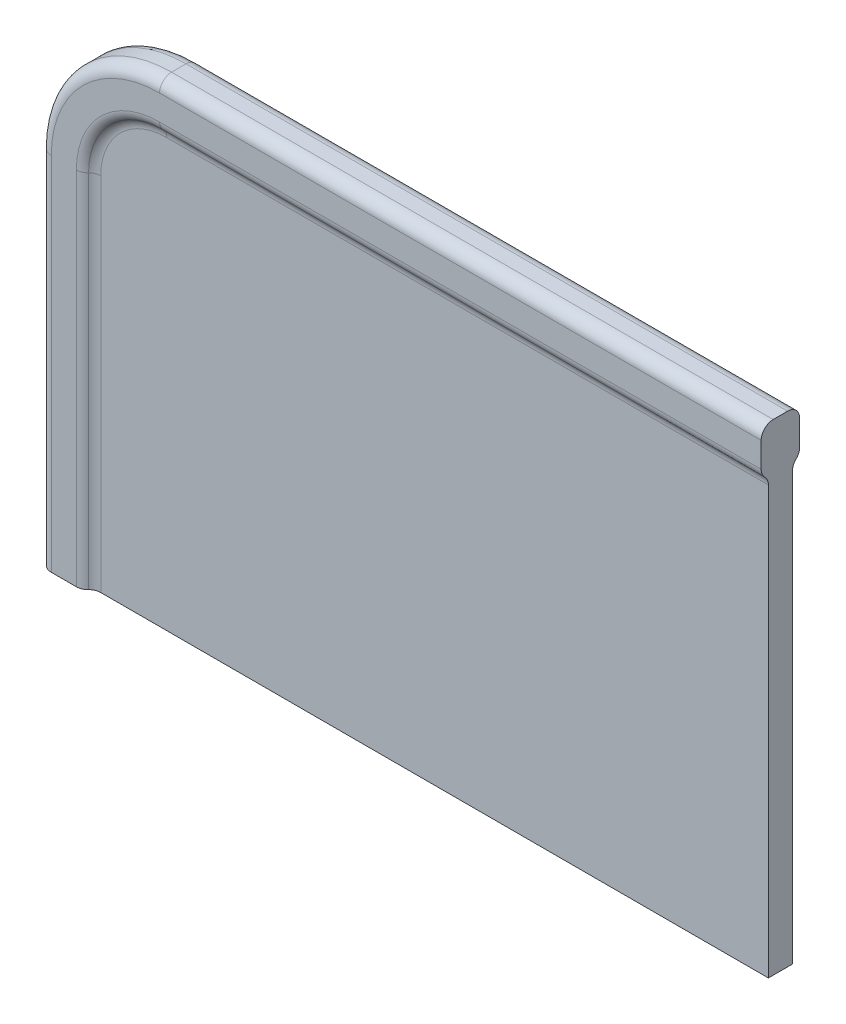
ISO-10303-21;
HEADER;
FILE_DESCRIPTION(('STEP AP214'),'2;1');
FILE_NAME('part.step','',(''),(''),'','','');
FILE_SCHEMA(('AUTOMOTIVE_DESIGN { 1 0 10303 214 1 1 1 1 }'));
ENDSEC;
DATA;
#1=APPLICATION_CONTEXT('core data for automotive mechanical design processes');
#2=APPLICATION_PROTOCOL_DEFINITION('international standard','automotive_design',2000,#1);
#3=PRODUCT_CONTEXT('',#1,'mechanical');
#4=PRODUCT('Part','Part','',(#3));
#5=PRODUCT_RELATED_PRODUCT_CATEGORY('part','',(#4));
#6=PRODUCT_DEFINITION_FORMATION('','',#4);
#7=PRODUCT_DEFINITION_CONTEXT('part definition',#1,'design');
#8=PRODUCT_DEFINITION('design','',#6,#7);
#9=PRODUCT_DEFINITION_SHAPE('','',#8);
#10=(LENGTH_UNIT() NAMED_UNIT(*) SI_UNIT(.MILLI.,.METRE.));
#11=(NAMED_UNIT(*) PLANE_ANGLE_UNIT() SI_UNIT($,.RADIAN.));
#12=(NAMED_UNIT(*) SI_UNIT($,.STERADIAN.) SOLID_ANGLE_UNIT());
#13=UNCERTAINTY_MEASURE_WITH_UNIT(LENGTH_MEASURE(1.E-05),#10,'distance_accuracy_value','');
#14=(GEOMETRIC_REPRESENTATION_CONTEXT(3) GLOBAL_UNCERTAINTY_ASSIGNED_CONTEXT((#13)) GLOBAL_UNIT_ASSIGNED_CONTEXT((#10,
#11,#12)) REPRESENTATION_CONTEXT('',''));
#15=CARTESIAN_POINT('',(0.,0.,0.));
#16=DIRECTION('',(0.,0.,1.));
#17=DIRECTION('',(1.,0.,0.));
#18=AXIS2_PLACEMENT_3D('',#15,#16,#17);
#19=CARTESIAN_POINT('',(0.,0.,0.));
#20=DIRECTION('',(0.,1.,0.));
#21=DIRECTION('',(0.,0.,1.));
#22=AXIS2_PLACEMENT_3D('',#19,#20,#21);
#23=PLANE('',#22);
#24=CARTESIAN_POINT('',(-176.175128514172,0.,6.35));
#25=DIRECTION('',(0.,1.,0.));
#26=DIRECTION('',(0.,0.,1.));
#27=AXIS2_PLACEMENT_3D('',#24,#25,#26);
#28=CIRCLE('',#27,3.175);
#29=CARTESIAN_POINT('',(-178.442532040235,0.,4.12749999999999));
#30=VERTEX_POINT('',#29);
#31=CARTESIAN_POINT('',(-176.175128514172,0.,3.175));
#32=VERTEX_POINT('',#31);
#33=EDGE_CURVE('E342',#30,#32,#28,.F.);
#34=ORIENTED_EDGE('',*,*,#33,.F.);
#35=CARTESIAN_POINT('',(-180.709935566297,0.,1.905));
#36=DIRECTION('',(0.,1.,0.));
#37=DIRECTION('',(0.,0.,1.));
#38=AXIS2_PLACEMENT_3D('',#35,#36,#37);
#39=CIRCLE('',#38,3.175);
#40=CARTESIAN_POINT('',(-180.709935566297,0.,5.08));
#41=VERTEX_POINT('',#40);
#42=EDGE_CURVE('E211',#30,#41,#39,.F.);
#43=ORIENTED_EDGE('',*,*,#42,.T.);
#44=DIRECTION('',(-1.,0.,0.));
#45=VECTOR('',#44,1.);
#46=CARTESIAN_POINT('',(171.45,0.,5.08));
#47=LINE('',#46,#45);
#48=CARTESIAN_POINT('',(-187.325,0.,5.08));
#49=VERTEX_POINT('',#48);
#50=EDGE_CURVE('E235',#41,#49,#47,.T.);
#51=ORIENTED_EDGE('',*,*,#50,.T.);
#52=CARTESIAN_POINT('',(-187.325,0.,1.905));
#53=DIRECTION('',(0.,1.,0.));
#54=DIRECTION('',(0.,0.,1.));
#55=AXIS2_PLACEMENT_3D('',#52,#53,#54);
#56=CIRCLE('',#55,3.175);
#57=CARTESIAN_POINT('',(-190.5,0.,1.905));
#58=VERTEX_POINT('',#57);
#59=EDGE_CURVE('E224',#49,#58,#56,.F.);
#60=ORIENTED_EDGE('',*,*,#59,.T.);
#61=DIRECTION('',(0.,0.,1.));
#62=VECTOR('',#61,1.);
#63=CARTESIAN_POINT('',(-190.5,0.,3.175));
#64=LINE('',#63,#62);
#65=CARTESIAN_POINT('',(-190.5,0.,-1.905));
#66=VERTEX_POINT('',#65);
#67=EDGE_CURVE('E240',#66,#58,#64,.T.);
#68=ORIENTED_EDGE('',*,*,#67,.F.);
#69=CARTESIAN_POINT('',(-187.325,0.,-1.905));
#70=DIRECTION('',(0.,1.,0.));
#71=DIRECTION('',(0.,0.,1.));
#72=AXIS2_PLACEMENT_3D('',#69,#70,#71);
#73=CIRCLE('',#72,3.175);
#74=CARTESIAN_POINT('',(-187.325,0.,-5.08));
#75=VERTEX_POINT('',#74);
#76=EDGE_CURVE('E221',#66,#75,#73,.F.);
#77=ORIENTED_EDGE('',*,*,#76,.T.);
#78=DIRECTION('',(1.,0.,0.));
#79=VECTOR('',#78,1.);
#80=CARTESIAN_POINT('',(171.45,0.,-5.08));
#81=LINE('',#80,#79);
#82=CARTESIAN_POINT('',(-180.709935566297,0.,-5.08));
#83=VERTEX_POINT('',#82);
#84=EDGE_CURVE('E230',#75,#83,#81,.T.);
#85=ORIENTED_EDGE('',*,*,#84,.T.);
#86=CARTESIAN_POINT('',(-180.709935566297,0.,-1.905));
#87=DIRECTION('',(0.,1.,0.));
#88=DIRECTION('',(0.,0.,1.));
#89=AXIS2_PLACEMENT_3D('',#86,#87,#88);
#90=CIRCLE('',#89,3.175);
#91=CARTESIAN_POINT('',(-178.442532040235,0.,-4.12749999999999));
#92=VERTEX_POINT('',#91);
#93=EDGE_CURVE('E216',#83,#92,#90,.F.);
#94=ORIENTED_EDGE('',*,*,#93,.T.);
#95=CARTESIAN_POINT('',(-176.175128514172,0.,-6.35));
#96=DIRECTION('',(0.,1.,0.));
#97=DIRECTION('',(0.,0.,1.));
#98=AXIS2_PLACEMENT_3D('',#95,#96,#97);
#99=CIRCLE('',#98,3.175);
#100=CARTESIAN_POINT('',(-176.175128514172,0.,-3.175));
#101=VERTEX_POINT('',#100);
#102=EDGE_CURVE('E193',#101,#92,#99,.F.);
#103=ORIENTED_EDGE('',*,*,#102,.F.);
#104=DIRECTION('',(1.,0.,0.));
#105=VECTOR('',#104,1.);
#106=CARTESIAN_POINT('',(0.,0.,-3.175));
#107=LINE('',#106,#105);
#108=CARTESIAN_POINT('',(0.,0.,-3.175));
#109=VERTEX_POINT('',#108);
#110=EDGE_CURVE('E227',#101,#109,#107,.T.);
#111=ORIENTED_EDGE('',*,*,#110,.T.);
#112=DIRECTION('',(0.,0.,-1.));
#113=VECTOR('',#112,1.);
#114=CARTESIAN_POINT('',(0.,0.,0.));
#115=LINE('',#114,#113);
#116=CARTESIAN_POINT('',(0.,0.,3.175));
#117=VERTEX_POINT('',#116);
#118=EDGE_CURVE('E11',#117,#109,#115,.T.);
#119=ORIENTED_EDGE('',*,*,#118,.F.);
#120=DIRECTION('',(1.,0.,0.));
#121=VECTOR('',#120,1.);
#122=CARTESIAN_POINT('',(0.,0.,3.175));
#123=LINE('',#122,#121);
#124=EDGE_CURVE('E348',#32,#117,#123,.T.);
#125=ORIENTED_EDGE('',*,*,#124,.F.);
#126=EDGE_LOOP('',(#34,#43,#51,#60,#68,#77,#85,#94,#103,#111,#119,#125));
#127=FACE_BOUND('',#126,.T.);
#128=ADVANCED_FACE('F39',(#127),#23,.F.);
#129=CARTESIAN_POINT('',(0.,0.,0.));
#130=DIRECTION('',(1.,0.,0.));
#131=DIRECTION('',(0.,0.,-1.));
#132=AXIS2_PLACEMENT_3D('',#129,#130,#131);
#133=PLANE('',#132);
#134=CARTESIAN_POINT('',(0.,112.675128514172,6.35));
#135=DIRECTION('',(1.,0.,0.));
#136=DIRECTION('',(0.,0.,-1.));
#137=AXIS2_PLACEMENT_3D('',#134,#135,#136);
#138=CIRCLE('',#137,3.175);
#139=CARTESIAN_POINT('',(0.,114.942532040235,4.1275));
#140=VERTEX_POINT('',#139);
#141=CARTESIAN_POINT('',(0.,112.675128514172,3.175));
#142=VERTEX_POINT('',#141);
#143=EDGE_CURVE('E210',#140,#142,#138,.F.);
#144=ORIENTED_EDGE('',*,*,#143,.T.);
#145=DIRECTION('',(0.,-1.,0.));
#146=VECTOR('',#145,1.);
#147=CARTESIAN_POINT('',(0.,0.,3.175));
#148=LINE('',#147,#146);
#149=EDGE_CURVE('E233',#142,#117,#148,.T.);
#150=ORIENTED_EDGE('',*,*,#149,.T.);
#151=ORIENTED_EDGE('',*,*,#118,.T.);
#152=DIRECTION('',(0.,-1.,0.));
#153=VECTOR('',#152,1.);
#154=CARTESIAN_POINT('',(0.,0.,-3.175));
#155=LINE('',#154,#153);
#156=CARTESIAN_POINT('',(0.,112.675128514172,-3.175));
#157=VERTEX_POINT('',#156);
#158=EDGE_CURVE('E209',#157,#109,#155,.T.);
#159=ORIENTED_EDGE('',*,*,#158,.F.);
#160=CARTESIAN_POINT('',(0.,112.675128514172,-6.35));
#161=DIRECTION('',(1.,0.,0.));
#162=DIRECTION('',(0.,0.,-1.));
#163=AXIS2_PLACEMENT_3D('',#160,#161,#162);
#164=CIRCLE('',#163,3.175);
#165=CARTESIAN_POINT('',(0.,114.942532040235,-4.1275));
#166=VERTEX_POINT('',#165);
#167=EDGE_CURVE('E43',#157,#166,#164,.F.);
#168=ORIENTED_EDGE('',*,*,#167,.T.);
#169=CARTESIAN_POINT('',(0.,117.209935566297,-1.905));
#170=DIRECTION('',(1.,0.,0.));
#171=DIRECTION('',(0.,0.,-1.));
#172=AXIS2_PLACEMENT_3D('',#169,#170,#171);
#173=CIRCLE('',#172,3.175);
#174=CARTESIAN_POINT('',(0.,117.209935566297,-5.08));
#175=VERTEX_POINT('',#174);
#176=EDGE_CURVE('E196',#175,#166,#173,.F.);
#177=ORIENTED_EDGE('',*,*,#176,.F.);
#178=DIRECTION('',(0.,-1.,0.));
#179=VECTOR('',#178,1.);
#180=CARTESIAN_POINT('',(0.,107.95,-5.08));
#181=LINE('',#180,#179);
#182=CARTESIAN_POINT('',(0.,123.825,-5.08));
#183=VERTEX_POINT('',#182);
#184=EDGE_CURVE('E346',#183,#175,#181,.T.);
#185=ORIENTED_EDGE('',*,*,#184,.F.);
#186=CARTESIAN_POINT('',(0.,123.825,-1.905));
#187=DIRECTION('',(1.,0.,0.));
#188=DIRECTION('',(0.,0.,-1.));
#189=AXIS2_PLACEMENT_3D('',#186,#187,#188);
#190=CIRCLE('',#189,3.175);
#191=CARTESIAN_POINT('',(0.,127.,-1.905));
#192=VERTEX_POINT('',#191);
#193=EDGE_CURVE('E203',#192,#183,#190,.F.);
#194=ORIENTED_EDGE('',*,*,#193,.F.);
#195=DIRECTION('',(0.,0.,1.));
#196=VECTOR('',#195,1.);
#197=CARTESIAN_POINT('',(0.,127.,3.175));
#198=LINE('',#197,#196);
#199=CARTESIAN_POINT('',(0.,127.,1.905));
#200=VERTEX_POINT('',#199);
#201=EDGE_CURVE('E238',#192,#200,#198,.T.);
#202=ORIENTED_EDGE('',*,*,#201,.T.);
#203=CARTESIAN_POINT('',(0.,123.825,1.905));
#204=DIRECTION('',(1.,0.,0.));
#205=DIRECTION('',(0.,0.,-1.));
#206=AXIS2_PLACEMENT_3D('',#203,#204,#205);
#207=CIRCLE('',#206,3.175);
#208=CARTESIAN_POINT('',(0.,123.825,5.08));
#209=VERTEX_POINT('',#208);
#210=EDGE_CURVE('E345',#209,#200,#207,.F.);
#211=ORIENTED_EDGE('',*,*,#210,.F.);
#212=DIRECTION('',(0.,1.,0.));
#213=VECTOR('',#212,1.);
#214=CARTESIAN_POINT('',(0.,107.95,5.08));
#215=LINE('',#214,#213);
#216=CARTESIAN_POINT('',(0.,117.209935566297,5.08));
#217=VERTEX_POINT('',#216);
#218=EDGE_CURVE('E351',#217,#209,#215,.T.);
#219=ORIENTED_EDGE('',*,*,#218,.F.);
#220=CARTESIAN_POINT('',(0.,117.209935566297,1.905));
#221=DIRECTION('',(1.,0.,0.));
#222=DIRECTION('',(0.,0.,-1.));
#223=AXIS2_PLACEMENT_3D('',#220,#221,#222);
#224=CIRCLE('',#223,3.175);
#225=EDGE_CURVE('E202',#140,#217,#224,.F.);
#226=ORIENTED_EDGE('',*,*,#225,.F.);
#227=EDGE_LOOP('',(#144,#150,#151,#159,#168,#177,#185,#194,#202,#211,#219,#226));
#228=FACE_BOUND('',#227,.T.);
#229=ADVANCED_FACE('F207',(#228),#133,.T.);
#230=CARTESIAN_POINT('',(-158.75,95.25,3.175));
#231=DIRECTION('',(0.,0.,-1.));
#232=DIRECTION('',(-1.,0.,0.));
#233=AXIS2_PLACEMENT_3D('',#230,#231,#232);
#234=CYLINDRICAL_SURFACE('',#233,31.75);
#235=DIRECTION('',(0.,0.,-1.));
#236=VECTOR('',#235,1.);
#237=CARTESIAN_POINT('',(-190.5,95.25,3.175));
#238=LINE('',#237,#236);
#239=CARTESIAN_POINT('',(-190.5,95.25,1.905));
#240=VERTEX_POINT('',#239);
#241=CARTESIAN_POINT('',(-190.5,95.25,-1.905));
#242=VERTEX_POINT('',#241);
#243=EDGE_CURVE('E270',#240,#242,#238,.T.);
#244=ORIENTED_EDGE('',*,*,#243,.F.);
#245=CARTESIAN_POINT('',(-158.75,95.25,1.905));
#246=DIRECTION('',(0.,0.,1.));
#247=DIRECTION('',(1.,0.,0.));
#248=AXIS2_PLACEMENT_3D('',#245,#246,#247);
#249=CIRCLE('',#248,31.75);
#250=CARTESIAN_POINT('',(-158.75,127.,1.905));
#251=VERTEX_POINT('',#250);
#252=EDGE_CURVE('E260',#240,#251,#249,.F.);
#253=ORIENTED_EDGE('',*,*,#252,.T.);
#254=DIRECTION('',(0.,0.,-1.));
#255=VECTOR('',#254,1.);
#256=CARTESIAN_POINT('',(-158.75,127.,3.175));
#257=LINE('',#256,#255);
#258=CARTESIAN_POINT('',(-158.75,127.,-1.905));
#259=VERTEX_POINT('',#258);
#260=EDGE_CURVE('E274',#259,#251,#257,.F.);
#261=ORIENTED_EDGE('',*,*,#260,.F.);
#262=CARTESIAN_POINT('',(-158.75,95.25,-1.905));
#263=DIRECTION('',(0.,0.,-1.));
#264=DIRECTION('',(-1.,0.,0.));
#265=AXIS2_PLACEMENT_3D('',#262,#263,#264);
#266=CIRCLE('',#265,31.75);
#267=EDGE_CURVE('E265',#259,#242,#266,.F.);
#268=ORIENTED_EDGE('',*,*,#267,.T.);
#269=EDGE_LOOP('',(#244,#253,#261,#268));
#270=FACE_BOUND('',#269,.T.);
#271=ADVANCED_FACE('F405',(#270),#234,.T.);
#272=CARTESIAN_POINT('',(-158.75,95.25,1.905));
#273=DIRECTION('',(0.,0.,1.));
#274=DIRECTION('',(1.,0.,0.));
#275=AXIS2_PLACEMENT_3D('',#272,#273,#274);
#276=TOROIDAL_SURFACE('',#275,28.575,3.175);
#277=CARTESIAN_POINT('',(-187.325,95.25,1.905));
#278=DIRECTION('',(0.,1.,0.));
#279=DIRECTION('',(0.,0.,1.));
#280=AXIS2_PLACEMENT_3D('',#277,#278,#279);
#281=CIRCLE('',#280,3.175);
#282=CARTESIAN_POINT('',(-187.325,95.25,5.08));
#283=VERTEX_POINT('',#282);
#284=EDGE_CURVE('E273',#240,#283,#281,.T.);
#285=ORIENTED_EDGE('',*,*,#284,.T.);
#286=CARTESIAN_POINT('',(-158.75,95.25,5.08));
#287=DIRECTION('',(0.,0.,1.));
#288=DIRECTION('',(1.,0.,0.));
#289=AXIS2_PLACEMENT_3D('',#286,#287,#288);
#290=CIRCLE('',#289,28.575);
#291=CARTESIAN_POINT('',(-158.75,123.825,5.08));
#292=VERTEX_POINT('',#291);
#293=EDGE_CURVE('E268',#292,#283,#290,.T.);
#294=ORIENTED_EDGE('',*,*,#293,.F.);
#295=CARTESIAN_POINT('',(-158.75,123.825,1.905));
#296=DIRECTION('',(1.,0.,0.));
#297=DIRECTION('',(0.,0.,-1.));
#298=AXIS2_PLACEMENT_3D('',#295,#296,#297);
#299=CIRCLE('',#298,3.175);
#300=EDGE_CURVE('E299',#251,#292,#299,.T.);
#301=ORIENTED_EDGE('',*,*,#300,.F.);
#302=ORIENTED_EDGE('',*,*,#252,.F.);
#303=EDGE_LOOP('',(#285,#294,#301,#302));
#304=FACE_BOUND('',#303,.T.);
#305=ADVANCED_FACE('F420',(#304),#276,.T.);
#306=CARTESIAN_POINT('',(-158.75,95.25,-1.905));
#307=DIRECTION('',(0.,0.,-1.));
#308=DIRECTION('',(-1.,0.,0.));
#309=AXIS2_PLACEMENT_3D('',#306,#307,#308);
#310=TOROIDAL_SURFACE('',#309,28.575,3.175);
#311=CARTESIAN_POINT('',(-187.325,95.25,-1.905));
#312=DIRECTION('',(0.,1.,0.));
#313=DIRECTION('',(0.,0.,1.));
#314=AXIS2_PLACEMENT_3D('',#311,#312,#313);
#315=CIRCLE('',#314,3.175);
#316=CARTESIAN_POINT('',(-187.325,95.25,-5.08));
#317=VERTEX_POINT('',#316);
#318=EDGE_CURVE('E302',#317,#242,#315,.T.);
#319=ORIENTED_EDGE('',*,*,#318,.T.);
#320=ORIENTED_EDGE('',*,*,#267,.F.);
#321=CARTESIAN_POINT('',(-158.75,123.825,-1.905));
#322=DIRECTION('',(1.,0.,0.));
#323=DIRECTION('',(0.,0.,-1.));
#324=AXIS2_PLACEMENT_3D('',#321,#322,#323);
#325=CIRCLE('',#324,3.175);
#326=CARTESIAN_POINT('',(-158.75,123.825,-5.08));
#327=VERTEX_POINT('',#326);
#328=EDGE_CURVE('E305',#327,#259,#325,.T.);
#329=ORIENTED_EDGE('',*,*,#328,.F.);
#330=CARTESIAN_POINT('',(-158.75,95.25,-5.08));
#331=DIRECTION('',(0.,0.,-1.));
#332=DIRECTION('',(-1.,0.,0.));
#333=AXIS2_PLACEMENT_3D('',#330,#331,#332);
#334=CIRCLE('',#333,28.575);
#335=EDGE_CURVE('E258',#317,#327,#334,.T.);
#336=ORIENTED_EDGE('',*,*,#335,.F.);
#337=EDGE_LOOP('',(#319,#320,#329,#336));
#338=FACE_BOUND('',#337,.T.);
#339=ADVANCED_FACE('F401',(#338),#310,.T.);
#340=CARTESIAN_POINT('',(-158.75,95.25,-1.905));
#341=DIRECTION('',(0.,0.,-1.));
#342=DIRECTION('',(-1.,0.,0.));
#343=AXIS2_PLACEMENT_3D('',#340,#341,#342);
#344=TOROIDAL_SURFACE('',#343,21.959935566297,3.175);
#345=CARTESIAN_POINT('',(-158.75,117.209935566297,-1.905));
#346=DIRECTION('',(1.,0.,0.));
#347=DIRECTION('',(0.,0.,-1.));
#348=AXIS2_PLACEMENT_3D('',#345,#346,#347);
#349=CIRCLE('',#348,3.175);
#350=CARTESIAN_POINT('',(-158.75,114.942532040235,-4.1275));
#351=VERTEX_POINT('',#350);
#352=CARTESIAN_POINT('',(-158.75,117.209935566297,-5.08));
#353=VERTEX_POINT('',#352);
#354=EDGE_CURVE('E311',#351,#353,#349,.T.);
#355=ORIENTED_EDGE('',*,*,#354,.F.);
#356=CARTESIAN_POINT('',(-158.75,95.25,-4.12750000000006));
#357=DIRECTION('',(0.,0.,1.));
#358=DIRECTION('',(1.,0.,0.));
#359=AXIS2_PLACEMENT_3D('',#356,#357,#358);
#360=CIRCLE('',#359,19.6925320402346);
#361=CARTESIAN_POINT('',(-178.442532040235,95.25,-4.1275));
#362=VERTEX_POINT('',#361);
#363=EDGE_CURVE('E192',#351,#362,#360,.T.);
#364=ORIENTED_EDGE('',*,*,#363,.T.);
#365=CARTESIAN_POINT('',(-180.709935566297,95.25,-1.905));
#366=DIRECTION('',(0.,1.,0.));
#367=DIRECTION('',(0.,0.,1.));
#368=AXIS2_PLACEMENT_3D('',#365,#366,#367);
#369=CIRCLE('',#368,3.175);
#370=CARTESIAN_POINT('',(-180.709935566297,95.25,-5.08));
#371=VERTEX_POINT('',#370);
#372=EDGE_CURVE('E308',#362,#371,#369,.T.);
#373=ORIENTED_EDGE('',*,*,#372,.T.);
#374=CARTESIAN_POINT('',(-158.75,95.25,-5.08));
#375=DIRECTION('',(0.,0.,-1.));
#376=DIRECTION('',(-1.,0.,0.));
#377=AXIS2_PLACEMENT_3D('',#374,#375,#376);
#378=CIRCLE('',#377,21.959935566297);
#379=EDGE_CURVE('E261',#353,#371,#378,.F.);
#380=ORIENTED_EDGE('',*,*,#379,.F.);
#381=EDGE_LOOP('',(#355,#364,#373,#380));
#382=FACE_BOUND('',#381,.T.);
#383=ADVANCED_FACE('F376',(#382),#344,.T.);
#384=CARTESIAN_POINT('',(171.45,107.95,-5.08));
#385=DIRECTION('',(0.,0.,-1.));
#386=DIRECTION('',(1.,0.,0.));
#387=AXIS2_PLACEMENT_3D('',#384,#385,#386);
#388=PLANE('',#387);
#389=DIRECTION('',(-1.,0.,0.));
#390=VECTOR('',#389,1.);
#391=CARTESIAN_POINT('',(171.45,123.825,-5.08));
#392=LINE('',#391,#390);
#393=EDGE_CURVE('E293',#327,#183,#392,.F.);
#394=ORIENTED_EDGE('',*,*,#393,.T.);
#395=ORIENTED_EDGE('',*,*,#184,.T.);
#396=DIRECTION('',(1.,0.,0.));
#397=VECTOR('',#396,1.);
#398=CARTESIAN_POINT('',(-158.75,117.209935566297,-5.08));
#399=LINE('',#398,#397);
#400=EDGE_CURVE('E198',#175,#353,#399,.F.);
#401=ORIENTED_EDGE('',*,*,#400,.T.);
#402=ORIENTED_EDGE('',*,*,#379,.T.);
#403=DIRECTION('',(0.,1.,0.));
#404=VECTOR('',#403,1.);
#405=CARTESIAN_POINT('',(-180.709935566297,-107.95,-5.08));
#406=LINE('',#405,#404);
#407=EDGE_CURVE('E290',#371,#83,#406,.F.);
#408=ORIENTED_EDGE('',*,*,#407,.T.);
#409=ORIENTED_EDGE('',*,*,#84,.F.);
#410=DIRECTION('',(0.,-1.,0.));
#411=VECTOR('',#410,1.);
#412=CARTESIAN_POINT('',(-187.325,95.25,-5.08));
#413=LINE('',#412,#411);
#414=EDGE_CURVE('E256',#75,#317,#413,.F.);
#415=ORIENTED_EDGE('',*,*,#414,.T.);
#416=ORIENTED_EDGE('',*,*,#335,.T.);
#417=EDGE_LOOP('',(#394,#395,#401,#402,#408,#409,#415,#416));
#418=FACE_BOUND('',#417,.T.);
#419=ADVANCED_FACE('F387',(#418),#388,.T.);
#420=CARTESIAN_POINT('',(-180.709935566297,95.25,-1.905));
#421=DIRECTION('',(0.,-1.,0.));
#422=DIRECTION('',(0.,0.,-1.));
#423=AXIS2_PLACEMENT_3D('',#420,#421,#422);
#424=CYLINDRICAL_SURFACE('',#423,3.175);
#425=ORIENTED_EDGE('',*,*,#93,.F.);
#426=ORIENTED_EDGE('',*,*,#407,.F.);
#427=ORIENTED_EDGE('',*,*,#372,.F.);
#428=DIRECTION('',(0.,-1.,0.));
#429=VECTOR('',#428,1.);
#430=CARTESIAN_POINT('',(-178.442532040235,95.25,-4.12749999999999));
#431=LINE('',#430,#429);
#432=EDGE_CURVE('E245',#362,#92,#431,.T.);
#433=ORIENTED_EDGE('',*,*,#432,.T.);
#434=EDGE_LOOP('',(#425,#426,#427,#433));
#435=FACE_BOUND('',#434,.T.);
#436=ADVANCED_FACE('F381',(#435),#424,.T.);
#437=CARTESIAN_POINT('',(171.45,117.209935566297,-1.905));
#438=DIRECTION('',(-1.,0.,0.));
#439=DIRECTION('',(0.,0.,1.));
#440=AXIS2_PLACEMENT_3D('',#437,#438,#439);
#441=CYLINDRICAL_SURFACE('',#440,3.175);
#442=ORIENTED_EDGE('',*,*,#400,.F.);
#443=ORIENTED_EDGE('',*,*,#176,.T.);
#444=DIRECTION('',(-1.,0.,0.));
#445=VECTOR('',#444,1.);
#446=CARTESIAN_POINT('',(171.45,114.942532040235,-4.1275));
#447=LINE('',#446,#445);
#448=EDGE_CURVE('E183',#166,#351,#447,.T.);
#449=ORIENTED_EDGE('',*,*,#448,.T.);
#450=ORIENTED_EDGE('',*,*,#354,.T.);
#451=EDGE_LOOP('',(#442,#443,#449,#450));
#452=FACE_BOUND('',#451,.T.);
#453=ADVANCED_FACE('F197',(#452),#441,.T.);
#454=CARTESIAN_POINT('',(-158.75,95.25,-6.35));
#455=DIRECTION('',(0.,0.,1.));
#456=DIRECTION('',(1.,0.,0.));
#457=AXIS2_PLACEMENT_3D('',#454,#455,#456);
#458=TOROIDAL_SURFACE('',#457,17.4251285141723,3.175);
#459=CARTESIAN_POINT('',(-176.175128514172,95.25,-6.35));
#460=DIRECTION('',(0.,-1.,0.));
#461=DIRECTION('',(0.,0.,-1.));
#462=AXIS2_PLACEMENT_3D('',#459,#460,#461);
#463=CIRCLE('',#462,3.175);
#464=CARTESIAN_POINT('',(-176.175128514172,95.25,-3.175));
#465=VERTEX_POINT('',#464);
#466=EDGE_CURVE('E336',#465,#362,#463,.T.);
#467=ORIENTED_EDGE('',*,*,#466,.T.);
#468=ORIENTED_EDGE('',*,*,#363,.F.);
#469=CARTESIAN_POINT('',(-158.75,112.675128514172,-6.35));
#470=DIRECTION('',(-1.,0.,0.));
#471=DIRECTION('',(0.,0.,1.));
#472=AXIS2_PLACEMENT_3D('',#469,#470,#471);
#473=CIRCLE('',#472,3.175);
#474=CARTESIAN_POINT('',(-158.75,112.675128514172,-3.175));
#475=VERTEX_POINT('',#474);
#476=EDGE_CURVE('E48',#475,#351,#473,.T.);
#477=ORIENTED_EDGE('',*,*,#476,.F.);
#478=CARTESIAN_POINT('',(-158.75,95.25,-3.175));
#479=DIRECTION('',(0.,0.,-1.));
#480=DIRECTION('',(-1.,0.,0.));
#481=AXIS2_PLACEMENT_3D('',#478,#479,#480);
#482=CIRCLE('',#481,17.4251285141723);
#483=EDGE_CURVE('E244',#465,#475,#482,.T.);
#484=ORIENTED_EDGE('',*,*,#483,.F.);
#485=EDGE_LOOP('',(#467,#468,#477,#484));
#486=FACE_BOUND('',#485,.T.);
#487=ADVANCED_FACE('F373',(#486),#458,.F.);
#488=CARTESIAN_POINT('',(0.,0.,-3.175));
#489=DIRECTION('',(0.,0.,-1.));
#490=DIRECTION('',(-1.,0.,0.));
#491=AXIS2_PLACEMENT_3D('',#488,#489,#490);
#492=PLANE('',#491);
#493=DIRECTION('',(1.,0.,0.));
#494=VECTOR('',#493,1.);
#495=CARTESIAN_POINT('',(171.45,112.675128514172,-3.175));
#496=LINE('',#495,#494);
#497=EDGE_CURVE('E327',#475,#157,#496,.T.);
#498=ORIENTED_EDGE('',*,*,#497,.T.);
#499=ORIENTED_EDGE('',*,*,#158,.T.);
#500=ORIENTED_EDGE('',*,*,#110,.F.);
#501=DIRECTION('',(0.,1.,0.));
#502=VECTOR('',#501,1.);
#503=CARTESIAN_POINT('',(-176.175128514172,95.25,-3.175));
#504=LINE('',#503,#502);
#505=EDGE_CURVE('E242',#101,#465,#504,.T.);
#506=ORIENTED_EDGE('',*,*,#505,.T.);
#507=ORIENTED_EDGE('',*,*,#483,.T.);
#508=EDGE_LOOP('',(#498,#499,#500,#506,#507));
#509=FACE_BOUND('',#508,.T.);
#510=ADVANCED_FACE('F368',(#509),#492,.T.);
#511=CARTESIAN_POINT('',(171.45,112.675128514172,-6.35));
#512=DIRECTION('',(-1.,0.,0.));
#513=DIRECTION('',(0.,0.,1.));
#514=AXIS2_PLACEMENT_3D('',#511,#512,#513);
#515=CYLINDRICAL_SURFACE('',#514,3.175);
#516=ORIENTED_EDGE('',*,*,#167,.F.);
#517=ORIENTED_EDGE('',*,*,#497,.F.);
#518=ORIENTED_EDGE('',*,*,#476,.T.);
#519=ORIENTED_EDGE('',*,*,#448,.F.);
#520=EDGE_LOOP('',(#516,#517,#518,#519));
#521=FACE_BOUND('',#520,.T.);
#522=ADVANCED_FACE('F185',(#521),#515,.F.);
#523=CARTESIAN_POINT('',(-176.175128514172,95.25,-6.35));
#524=DIRECTION('',(0.,-1.,0.));
#525=DIRECTION('',(0.,0.,-1.));
#526=AXIS2_PLACEMENT_3D('',#523,#524,#525);
#527=CYLINDRICAL_SURFACE('',#526,3.175);
#528=ORIENTED_EDGE('',*,*,#505,.F.);
#529=ORIENTED_EDGE('',*,*,#102,.T.);
#530=ORIENTED_EDGE('',*,*,#432,.F.);
#531=ORIENTED_EDGE('',*,*,#466,.F.);
#532=EDGE_LOOP('',(#528,#529,#530,#531));
#533=FACE_BOUND('',#532,.T.);
#534=ADVANCED_FACE('F383',(#533),#527,.F.);
#535=CARTESIAN_POINT('',(-190.5,127.,3.175));
#536=DIRECTION('',(0.,-1.,0.));
#537=DIRECTION('',(0.,0.,-1.));
#538=AXIS2_PLACEMENT_3D('',#535,#536,#537);
#539=PLANE('',#538);
#540=ORIENTED_EDGE('',*,*,#201,.F.);
#541=DIRECTION('',(-1.,0.,0.));
#542=VECTOR('',#541,1.);
#543=CARTESIAN_POINT('',(-158.75,127.,-1.905));
#544=LINE('',#543,#542);
#545=EDGE_CURVE('E254',#192,#259,#544,.T.);
#546=ORIENTED_EDGE('',*,*,#545,.T.);
#547=ORIENTED_EDGE('',*,*,#260,.T.);
#548=DIRECTION('',(-1.,0.,0.));
#549=VECTOR('',#548,1.);
#550=CARTESIAN_POINT('',(171.45,127.,1.905));
#551=LINE('',#550,#549);
#552=EDGE_CURVE('E252',#251,#200,#551,.F.);
#553=ORIENTED_EDGE('',*,*,#552,.T.);
#554=EDGE_LOOP('',(#540,#546,#547,#553));
#555=FACE_BOUND('',#554,.T.);
#556=ADVANCED_FACE('F393',(#555),#539,.F.);
#557=CARTESIAN_POINT('',(-190.5,123.825,-1.905));
#558=DIRECTION('',(1.,0.,0.));
#559=DIRECTION('',(0.,0.,-1.));
#560=AXIS2_PLACEMENT_3D('',#557,#558,#559);
#561=CYLINDRICAL_SURFACE('',#560,3.175);
#562=ORIENTED_EDGE('',*,*,#545,.F.);
#563=ORIENTED_EDGE('',*,*,#193,.T.);
#564=ORIENTED_EDGE('',*,*,#393,.F.);
#565=ORIENTED_EDGE('',*,*,#328,.T.);
#566=EDGE_LOOP('',(#562,#563,#564,#565));
#567=FACE_BOUND('',#566,.T.);
#568=ADVANCED_FACE('F396',(#567),#561,.T.);
#569=CARTESIAN_POINT('',(-190.5,-127.,3.175));
#570=DIRECTION('',(1.,0.,0.));
#571=DIRECTION('',(0.,0.,-1.));
#572=AXIS2_PLACEMENT_3D('',#569,#570,#571);
#573=PLANE('',#572);
#574=DIRECTION('',(0.,-1.,0.));
#575=VECTOR('',#574,1.);
#576=CARTESIAN_POINT('',(-190.5,-107.95,-1.905));
#577=LINE('',#576,#575);
#578=EDGE_CURVE('E264',#242,#66,#577,.T.);
#579=ORIENTED_EDGE('',*,*,#578,.T.);
#580=ORIENTED_EDGE('',*,*,#67,.T.);
#581=DIRECTION('',(0.,-1.,0.));
#582=VECTOR('',#581,1.);
#583=CARTESIAN_POINT('',(-190.5,95.25,1.905));
#584=LINE('',#583,#582);
#585=EDGE_CURVE('E262',#58,#240,#584,.F.);
#586=ORIENTED_EDGE('',*,*,#585,.T.);
#587=ORIENTED_EDGE('',*,*,#243,.T.);
#588=EDGE_LOOP('',(#579,#580,#586,#587));
#589=FACE_BOUND('',#588,.T.);
#590=ADVANCED_FACE('F409',(#589),#573,.F.);
#591=CARTESIAN_POINT('',(-187.325,-127.,-1.905));
#592=DIRECTION('',(0.,1.,0.));
#593=DIRECTION('',(0.,0.,1.));
#594=AXIS2_PLACEMENT_3D('',#591,#592,#593);
#595=CYLINDRICAL_SURFACE('',#594,3.175);
#596=ORIENTED_EDGE('',*,*,#76,.F.);
#597=ORIENTED_EDGE('',*,*,#578,.F.);
#598=ORIENTED_EDGE('',*,*,#318,.F.);
#599=ORIENTED_EDGE('',*,*,#414,.F.);
#600=EDGE_LOOP('',(#596,#597,#598,#599));
#601=FACE_BOUND('',#600,.T.);
#602=ADVANCED_FACE('F412',(#601),#595,.T.);
#603=CARTESIAN_POINT('',(-158.75,95.25,1.905));
#604=DIRECTION('',(0.,0.,1.));
#605=DIRECTION('',(1.,0.,0.));
#606=AXIS2_PLACEMENT_3D('',#603,#604,#605);
#607=TOROIDAL_SURFACE('',#606,21.959935566297,3.175);
#608=CARTESIAN_POINT('',(-180.709935566297,95.25,1.905));
#609=DIRECTION('',(0.,1.,0.));
#610=DIRECTION('',(0.,0.,1.));
#611=AXIS2_PLACEMENT_3D('',#608,#609,#610);
#612=CIRCLE('',#611,3.175);
#613=CARTESIAN_POINT('',(-180.709935566297,95.25,5.08));
#614=VERTEX_POINT('',#613);
#615=CARTESIAN_POINT('',(-178.442532040235,95.25,4.1275));
#616=VERTEX_POINT('',#615);
#617=EDGE_CURVE('E313',#614,#616,#612,.T.);
#618=ORIENTED_EDGE('',*,*,#617,.T.);
#619=CARTESIAN_POINT('',(-158.75,95.25,4.12749999999997));
#620=DIRECTION('',(0.,0.,-1.));
#621=DIRECTION('',(-1.,0.,0.));
#622=AXIS2_PLACEMENT_3D('',#619,#620,#621);
#623=CIRCLE('',#622,19.6925320402346);
#624=CARTESIAN_POINT('',(-158.75,114.942532040235,4.1275));
#625=VERTEX_POINT('',#624);
#626=EDGE_CURVE('E249',#616,#625,#623,.T.);
#627=ORIENTED_EDGE('',*,*,#626,.T.);
#628=CARTESIAN_POINT('',(-158.75,117.209935566297,1.905));
#629=DIRECTION('',(1.,0.,0.));
#630=DIRECTION('',(0.,0.,-1.));
#631=AXIS2_PLACEMENT_3D('',#628,#629,#630);
#632=CIRCLE('',#631,3.175);
#633=CARTESIAN_POINT('',(-158.75,117.209935566297,5.08));
#634=VERTEX_POINT('',#633);
#635=EDGE_CURVE('E315',#634,#625,#632,.T.);
#636=ORIENTED_EDGE('',*,*,#635,.F.);
#637=CARTESIAN_POINT('',(-158.75,95.25,5.08));
#638=DIRECTION('',(0.,0.,1.));
#639=DIRECTION('',(1.,0.,0.));
#640=AXIS2_PLACEMENT_3D('',#637,#638,#639);
#641=CIRCLE('',#640,21.959935566297);
#642=EDGE_CURVE('E56',#614,#634,#641,.F.);
#643=ORIENTED_EDGE('',*,*,#642,.F.);
#644=EDGE_LOOP('',(#618,#627,#636,#643));
#645=FACE_BOUND('',#644,.T.);
#646=ADVANCED_FACE('F443',(#645),#607,.T.);
#647=CARTESIAN_POINT('',(171.45,107.95,5.08));
#648=DIRECTION('',(0.,0.,1.));
#649=DIRECTION('',(1.,0.,0.));
#650=AXIS2_PLACEMENT_3D('',#647,#648,#649);
#651=PLANE('',#650);
#652=DIRECTION('',(-1.,0.,0.));
#653=VECTOR('',#652,1.);
#654=CARTESIAN_POINT('',(171.45,117.209935566297,5.08));
#655=LINE('',#654,#653);
#656=EDGE_CURVE('E277',#634,#217,#655,.F.);
#657=ORIENTED_EDGE('',*,*,#656,.T.);
#658=ORIENTED_EDGE('',*,*,#218,.T.);
#659=DIRECTION('',(-1.,0.,0.));
#660=VECTOR('',#659,1.);
#661=CARTESIAN_POINT('',(-158.75,123.825,5.08));
#662=LINE('',#661,#660);
#663=EDGE_CURVE('E266',#209,#292,#662,.T.);
#664=ORIENTED_EDGE('',*,*,#663,.T.);
#665=ORIENTED_EDGE('',*,*,#293,.T.);
#666=DIRECTION('',(0.,-1.,0.));
#667=VECTOR('',#666,1.);
#668=CARTESIAN_POINT('',(-187.325,-107.95,5.08));
#669=LINE('',#668,#667);
#670=EDGE_CURVE('E281',#283,#49,#669,.T.);
#671=ORIENTED_EDGE('',*,*,#670,.T.);
#672=ORIENTED_EDGE('',*,*,#50,.F.);
#673=DIRECTION('',(0.,-1.,0.));
#674=VECTOR('',#673,1.);
#675=CARTESIAN_POINT('',(-180.709935566297,95.25,5.08));
#676=LINE('',#675,#674);
#677=EDGE_CURVE('E61',#41,#614,#676,.F.);
#678=ORIENTED_EDGE('',*,*,#677,.T.);
#679=ORIENTED_EDGE('',*,*,#642,.T.);
#680=EDGE_LOOP('',(#657,#658,#664,#665,#671,#672,#678,#679));
#681=FACE_BOUND('',#680,.T.);
#682=ADVANCED_FACE('F424',(#681),#651,.T.);
#683=CARTESIAN_POINT('',(0.,0.,3.175));
#684=DIRECTION('',(0.,0.,-1.));
#685=DIRECTION('',(-1.,0.,0.));
#686=AXIS2_PLACEMENT_3D('',#683,#684,#685);
#687=PLANE('',#686);
#688=ORIENTED_EDGE('',*,*,#149,.F.);
#689=DIRECTION('',(1.,0.,0.));
#690=VECTOR('',#689,1.);
#691=CARTESIAN_POINT('',(0.,112.675128514172,3.175));
#692=LINE('',#691,#690);
#693=CARTESIAN_POINT('',(-158.75,112.675128514172,3.175));
#694=VERTEX_POINT('',#693);
#695=EDGE_CURVE('E250',#142,#694,#692,.F.);
#696=ORIENTED_EDGE('',*,*,#695,.T.);
#697=CARTESIAN_POINT('',(-158.75,95.25,3.175));
#698=DIRECTION('',(0.,0.,-1.));
#699=DIRECTION('',(-1.,0.,0.));
#700=AXIS2_PLACEMENT_3D('',#697,#698,#699);
#701=CIRCLE('',#700,17.4251285141723);
#702=CARTESIAN_POINT('',(-176.175128514172,95.25,3.175));
#703=VERTEX_POINT('',#702);
#704=EDGE_CURVE('E253',#694,#703,#701,.F.);
#705=ORIENTED_EDGE('',*,*,#704,.T.);
#706=DIRECTION('',(0.,1.,0.));
#707=VECTOR('',#706,1.);
#708=CARTESIAN_POINT('',(-176.175128514172,0.,3.175));
#709=LINE('',#708,#707);
#710=EDGE_CURVE('E248',#703,#32,#709,.F.);
#711=ORIENTED_EDGE('',*,*,#710,.T.);
#712=ORIENTED_EDGE('',*,*,#124,.T.);
#713=EDGE_LOOP('',(#688,#696,#705,#711,#712));
#714=FACE_BOUND('',#713,.T.);
#715=ADVANCED_FACE('F361',(#714),#687,.F.);
#716=CARTESIAN_POINT('',(-158.75,95.25,6.35));
#717=DIRECTION('',(0.,0.,1.));
#718=DIRECTION('',(1.,0.,0.));
#719=AXIS2_PLACEMENT_3D('',#716,#717,#718);
#720=TOROIDAL_SURFACE('',#719,17.4251285141723,3.175);
#721=CARTESIAN_POINT('',(-176.175128514172,95.25,6.34999999999999));
#722=DIRECTION('',(0.,-1.,0.));
#723=DIRECTION('',(0.,0.,-1.));
#724=AXIS2_PLACEMENT_3D('',#721,#722,#723);
#725=CIRCLE('',#724,3.175);
#726=EDGE_CURVE('E318',#616,#703,#725,.T.);
#727=ORIENTED_EDGE('',*,*,#726,.T.);
#728=ORIENTED_EDGE('',*,*,#704,.F.);
#729=CARTESIAN_POINT('',(-158.75,112.675128514172,6.35));
#730=DIRECTION('',(-1.,0.,0.));
#731=DIRECTION('',(0.,0.,1.));
#732=AXIS2_PLACEMENT_3D('',#729,#730,#731);
#733=CIRCLE('',#732,3.175);
#734=EDGE_CURVE('E333',#625,#694,#733,.T.);
#735=ORIENTED_EDGE('',*,*,#734,.F.);
#736=ORIENTED_EDGE('',*,*,#626,.F.);
#737=EDGE_LOOP('',(#727,#728,#735,#736));
#738=FACE_BOUND('',#737,.T.);
#739=ADVANCED_FACE('F434',(#738),#720,.F.);
#740=CARTESIAN_POINT('',(171.45,117.209935566297,1.905));
#741=DIRECTION('',(1.,0.,0.));
#742=DIRECTION('',(0.,0.,-1.));
#743=AXIS2_PLACEMENT_3D('',#740,#741,#742);
#744=CYLINDRICAL_SURFACE('',#743,3.175);
#745=DIRECTION('',(1.,0.,0.));
#746=VECTOR('',#745,1.);
#747=CARTESIAN_POINT('',(171.45,114.942532040235,4.1275));
#748=LINE('',#747,#746);
#749=EDGE_CURVE('E325',#625,#140,#748,.T.);
#750=ORIENTED_EDGE('',*,*,#749,.T.);
#751=ORIENTED_EDGE('',*,*,#225,.T.);
#752=ORIENTED_EDGE('',*,*,#656,.F.);
#753=ORIENTED_EDGE('',*,*,#635,.T.);
#754=EDGE_LOOP('',(#750,#751,#752,#753));
#755=FACE_BOUND('',#754,.T.);
#756=ADVANCED_FACE('F427',(#755),#744,.T.);
#757=CARTESIAN_POINT('',(171.45,112.675128514172,6.35));
#758=DIRECTION('',(1.,0.,0.));
#759=DIRECTION('',(0.,0.,-1.));
#760=AXIS2_PLACEMENT_3D('',#757,#758,#759);
#761=CYLINDRICAL_SURFACE('',#760,3.175);
#762=ORIENTED_EDGE('',*,*,#143,.F.);
#763=ORIENTED_EDGE('',*,*,#749,.F.);
#764=ORIENTED_EDGE('',*,*,#734,.T.);
#765=ORIENTED_EDGE('',*,*,#695,.F.);
#766=EDGE_LOOP('',(#762,#763,#764,#765));
#767=FACE_BOUND('',#766,.T.);
#768=ADVANCED_FACE('F431',(#767),#761,.F.);
#769=CARTESIAN_POINT('',(-180.709935566297,95.25,1.905));
#770=DIRECTION('',(0.,1.,0.));
#771=DIRECTION('',(0.,0.,1.));
#772=AXIS2_PLACEMENT_3D('',#769,#770,#771);
#773=CYLINDRICAL_SURFACE('',#772,3.175);
#774=ORIENTED_EDGE('',*,*,#42,.F.);
#775=DIRECTION('',(0.,1.,0.));
#776=VECTOR('',#775,1.);
#777=CARTESIAN_POINT('',(-178.442532040235,95.25,4.12749999999999));
#778=LINE('',#777,#776);
#779=EDGE_CURVE('E246',#30,#616,#778,.T.);
#780=ORIENTED_EDGE('',*,*,#779,.T.);
#781=ORIENTED_EDGE('',*,*,#617,.F.);
#782=ORIENTED_EDGE('',*,*,#677,.F.);
#783=EDGE_LOOP('',(#774,#780,#781,#782));
#784=FACE_BOUND('',#783,.T.);
#785=ADVANCED_FACE('F441',(#784),#773,.T.);
#786=CARTESIAN_POINT('',(-176.175128514172,95.25,6.35));
#787=DIRECTION('',(0.,1.,0.));
#788=DIRECTION('',(0.,0.,1.));
#789=AXIS2_PLACEMENT_3D('',#786,#787,#788);
#790=CYLINDRICAL_SURFACE('',#789,3.175);
#791=ORIENTED_EDGE('',*,*,#779,.F.);
#792=ORIENTED_EDGE('',*,*,#33,.T.);
#793=ORIENTED_EDGE('',*,*,#710,.F.);
#794=ORIENTED_EDGE('',*,*,#726,.F.);
#795=EDGE_LOOP('',(#791,#792,#793,#794));
#796=FACE_BOUND('',#795,.T.);
#797=ADVANCED_FACE('F439',(#796),#790,.F.);
#798=CARTESIAN_POINT('',(171.45,123.825,1.905));
#799=DIRECTION('',(1.,0.,0.));
#800=DIRECTION('',(0.,0.,-1.));
#801=AXIS2_PLACEMENT_3D('',#798,#799,#800);
#802=CYLINDRICAL_SURFACE('',#801,3.175);
#803=ORIENTED_EDGE('',*,*,#663,.F.);
#804=ORIENTED_EDGE('',*,*,#210,.T.);
#805=ORIENTED_EDGE('',*,*,#552,.F.);
#806=ORIENTED_EDGE('',*,*,#300,.T.);
#807=EDGE_LOOP('',(#803,#804,#805,#806));
#808=FACE_BOUND('',#807,.T.);
#809=ADVANCED_FACE('F41',(#808),#802,.T.);
#810=CARTESIAN_POINT('',(-187.325,107.95,1.905));
#811=DIRECTION('',(0.,1.,0.));
#812=DIRECTION('',(0.,0.,1.));
#813=AXIS2_PLACEMENT_3D('',#810,#811,#812);
#814=CYLINDRICAL_SURFACE('',#813,3.175);
#815=ORIENTED_EDGE('',*,*,#59,.F.);
#816=ORIENTED_EDGE('',*,*,#670,.F.);
#817=ORIENTED_EDGE('',*,*,#284,.F.);
#818=ORIENTED_EDGE('',*,*,#585,.F.);
#819=EDGE_LOOP('',(#815,#816,#817,#818));
#820=FACE_BOUND('',#819,.T.);
#821=ADVANCED_FACE('F415',(#820),#814,.T.);
#822=CLOSED_SHELL('',(#128,#229,#271,#305,#339,#383,#419,#436,#453,#487,#510,#522,#534,#556,
#568,#590,#602,#646,#682,#715,#739,#756,#768,#785,#797,#809,#821));
#823=MANIFOLD_SOLID_BREP('B2',#822);
#824=ADVANCED_BREP_SHAPE_REPRESENTATION('',(#18,#823),#14);
#825=SHAPE_DEFINITION_REPRESENTATION(#9,#824);
ENDSEC;
END-ISO-10303-21;
